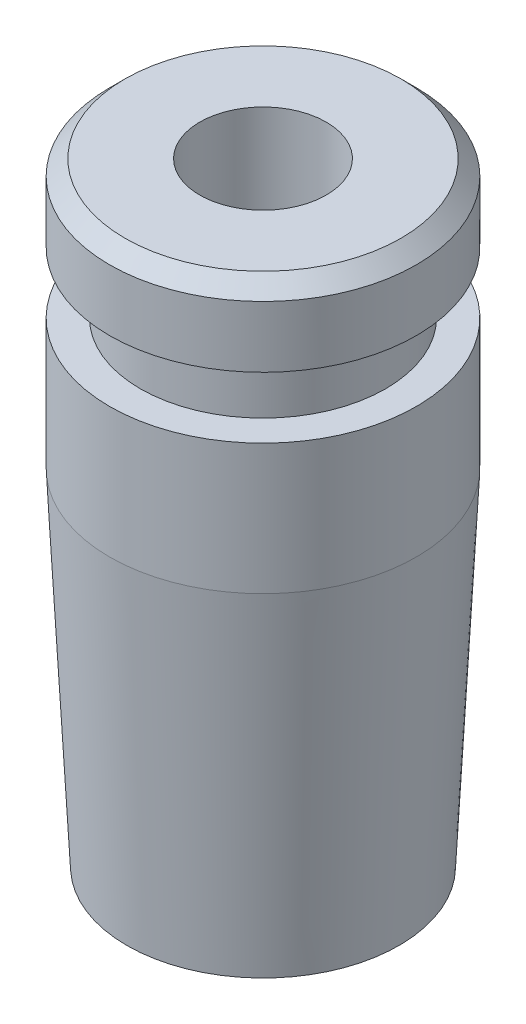
ISO-10303-21;
HEADER;
FILE_DESCRIPTION(('STEP AP214'),'2;1');
FILE_NAME('part.step','',(''),(''),'','','');
FILE_SCHEMA(('AUTOMOTIVE_DESIGN { 1 0 10303 214 1 1 1 1 }'));
ENDSEC;
DATA;
#1=APPLICATION_CONTEXT('core data for automotive mechanical design processes');
#2=APPLICATION_PROTOCOL_DEFINITION('international standard','automotive_design',2000,#1);
#3=PRODUCT_CONTEXT('',#1,'mechanical');
#4=PRODUCT('Part','Part','',(#3));
#5=PRODUCT_RELATED_PRODUCT_CATEGORY('part','',(#4));
#6=PRODUCT_DEFINITION_FORMATION('','',#4);
#7=PRODUCT_DEFINITION_CONTEXT('part definition',#1,'design');
#8=PRODUCT_DEFINITION('design','',#6,#7);
#9=PRODUCT_DEFINITION_SHAPE('','',#8);
#10=(LENGTH_UNIT() NAMED_UNIT(*) SI_UNIT(.MILLI.,.METRE.));
#11=(NAMED_UNIT(*) PLANE_ANGLE_UNIT() SI_UNIT($,.RADIAN.));
#12=(NAMED_UNIT(*) SI_UNIT($,.STERADIAN.) SOLID_ANGLE_UNIT());
#13=UNCERTAINTY_MEASURE_WITH_UNIT(LENGTH_MEASURE(1.E-05),#10,'distance_accuracy_value','');
#14=(GEOMETRIC_REPRESENTATION_CONTEXT(3) GLOBAL_UNCERTAINTY_ASSIGNED_CONTEXT((#13)) GLOBAL_UNIT_ASSIGNED_CONTEXT((#10,
#11,#12)) REPRESENTATION_CONTEXT('',''));
#15=CARTESIAN_POINT('',(0.,0.,0.));
#16=DIRECTION('',(0.,0.,1.));
#17=DIRECTION('',(1.,0.,0.));
#18=AXIS2_PLACEMENT_3D('',#15,#16,#17);
#19=CARTESIAN_POINT('',(0.,45.9930793876825,0.));
#20=DIRECTION('',(0.,1.,0.));
#21=DIRECTION('',(0.,0.,1.));
#22=AXIS2_PLACEMENT_3D('',#19,#20,#21);
#23=CYLINDRICAL_SURFACE('',#22,4.);
#24=CARTESIAN_POINT('',(0.,15.,0.));
#25=DIRECTION('',(0.,1.,0.));
#26=DIRECTION('',(0.,0.,1.));
#27=AXIS2_PLACEMENT_3D('',#24,#25,#26);
#28=CIRCLE('',#27,4.);
#29=CARTESIAN_POINT('',(0.,15.,4.));
#30=VERTEX_POINT('',#29);
#31=EDGE_CURVE('E18',#30,#30,#28,.F.);
#32=ORIENTED_EDGE('',*,*,#31,.F.);
#33=EDGE_LOOP('',(#32));
#34=FACE_BOUND('',#33,.T.);
#35=CARTESIAN_POINT('',(0.,16.5999999999826,0.));
#36=DIRECTION('',(0.,-1.,0.));
#37=DIRECTION('',(0.,0.,-1.));
#38=AXIS2_PLACEMENT_3D('',#35,#36,#37);
#39=CIRCLE('',#38,4.0000000000191);
#40=CARTESIAN_POINT('',(0.,16.5999999999826,-4.0000000000191));
#41=VERTEX_POINT('',#40);
#42=EDGE_CURVE('E30',#41,#41,#39,.F.);
#43=ORIENTED_EDGE('',*,*,#42,.F.);
#44=EDGE_LOOP('',(#43));
#45=FACE_BOUND('',#44,.T.);
#46=ADVANCED_FACE('F15',(#34,#45),#23,.T.);
#47=CARTESIAN_POINT('',(0.,16.6000000000395,0.));
#48=DIRECTION('',(0.,-1.,0.));
#49=DIRECTION('',(0.,0.,-1.));
#50=AXIS2_PLACEMENT_3D('',#47,#48,#49);
#51=CONICAL_SURFACE('',#50,3.99999999990542,0.785398163326394);
#52=ORIENTED_EDGE('',*,*,#42,.T.);
#53=EDGE_LOOP('',(#52));
#54=FACE_BOUND('',#53,.T.);
#55=CARTESIAN_POINT('',(0.,17.0000000000528,0.));
#56=DIRECTION('',(0.,-1.,0.));
#57=DIRECTION('',(0.,0.,-1.));
#58=AXIS2_PLACEMENT_3D('',#55,#56,#57);
#59=CIRCLE('',#58,3.59999999994898);
#60=CARTESIAN_POINT('',(0.,17.0000000000528,-3.59999999994898));
#61=VERTEX_POINT('',#60);
#62=EDGE_CURVE('E46',#61,#61,#59,.F.);
#63=ORIENTED_EDGE('',*,*,#62,.F.);
#64=EDGE_LOOP('',(#63));
#65=FACE_BOUND('',#64,.T.);
#66=ADVANCED_FACE('F58',(#54,#65),#51,.T.);
#67=CARTESIAN_POINT('',(-4.,15.,0.));
#68=DIRECTION('',(0.,-1.,0.));
#69=DIRECTION('',(0.,0.,-1.));
#70=AXIS2_PLACEMENT_3D('',#67,#68,#69);
#71=PLANE('',#70);
#72=ORIENTED_EDGE('',*,*,#31,.T.);
#73=EDGE_LOOP('',(#72));
#74=FACE_BOUND('',#73,.T.);
#75=CARTESIAN_POINT('',(0.,15.,0.));
#76=DIRECTION('',(0.,1.,0.));
#77=DIRECTION('',(0.,0.,1.));
#78=AXIS2_PLACEMENT_3D('',#75,#76,#77);
#79=CIRCLE('',#78,3.2);
#80=CARTESIAN_POINT('',(0.,15.,3.2));
#81=VERTEX_POINT('',#80);
#82=EDGE_CURVE('E44',#81,#81,#79,.F.);
#83=ORIENTED_EDGE('',*,*,#82,.F.);
#84=EDGE_LOOP('',(#83));
#85=FACE_BOUND('',#84,.T.);
#86=ADVANCED_FACE('F53',(#74,#85),#71,.T.);
#87=CARTESIAN_POINT('',(0.,17.,0.));
#88=DIRECTION('',(0.,1.,0.));
#89=DIRECTION('',(0.,0.,1.));
#90=AXIS2_PLACEMENT_3D('',#87,#88,#89);
#91=PLANE('',#90);
#92=CARTESIAN_POINT('',(0.,17.,0.));
#93=DIRECTION('',(0.,-1.,0.));
#94=DIRECTION('',(0.,0.,-1.));
#95=AXIS2_PLACEMENT_3D('',#92,#93,#94);
#96=CIRCLE('',#95,1.65);
#97=CARTESIAN_POINT('',(0.,17.,-1.65));
#98=VERTEX_POINT('',#97);
#99=EDGE_CURVE('E41',#98,#98,#96,.T.);
#100=ORIENTED_EDGE('',*,*,#99,.T.);
#101=EDGE_LOOP('',(#100));
#102=FACE_BOUND('',#101,.T.);
#103=ORIENTED_EDGE('',*,*,#62,.T.);
#104=EDGE_LOOP('',(#103));
#105=FACE_BOUND('',#104,.T.);
#106=ADVANCED_FACE('F68',(#102,#105),#91,.T.);
#107=CARTESIAN_POINT('',(0.,45.9930793876825,0.));
#108=DIRECTION('',(0.,1.,0.));
#109=DIRECTION('',(0.,0.,1.));
#110=AXIS2_PLACEMENT_3D('',#107,#108,#109);
#111=CYLINDRICAL_SURFACE('',#110,3.2);
#112=CARTESIAN_POINT('',(0.,13.4,0.));
#113=DIRECTION('',(0.,1.,0.));
#114=DIRECTION('',(0.,0.,1.));
#115=AXIS2_PLACEMENT_3D('',#112,#113,#114);
#116=CIRCLE('',#115,3.2);
#117=CARTESIAN_POINT('',(0.,13.4,3.2));
#118=VERTEX_POINT('',#117);
#119=EDGE_CURVE('E38',#118,#118,#116,.F.);
#120=ORIENTED_EDGE('',*,*,#119,.F.);
#121=EDGE_LOOP('',(#120));
#122=FACE_BOUND('',#121,.T.);
#123=ORIENTED_EDGE('',*,*,#82,.T.);
#124=EDGE_LOOP('',(#123));
#125=FACE_BOUND('',#124,.T.);
#126=ADVANCED_FACE('F93',(#122,#125),#111,.T.);
#127=CARTESIAN_POINT('',(0.,1.,0.));
#128=DIRECTION('',(0.,-1.,0.));
#129=DIRECTION('',(0.,0.,-1.));
#130=AXIS2_PLACEMENT_3D('',#127,#128,#129);
#131=CYLINDRICAL_SURFACE('',#130,1.65);
#132=CARTESIAN_POINT('',(0.,1.,0.));
#133=DIRECTION('',(0.,-1.,0.));
#134=DIRECTION('',(0.,0.,-1.));
#135=AXIS2_PLACEMENT_3D('',#132,#133,#134);
#136=CIRCLE('',#135,1.65);
#137=CARTESIAN_POINT('',(0.,1.,-1.65));
#138=VERTEX_POINT('',#137);
#139=EDGE_CURVE('E35',#138,#138,#136,.F.);
#140=ORIENTED_EDGE('',*,*,#139,.F.);
#141=EDGE_LOOP('',(#140));
#142=FACE_BOUND('',#141,.T.);
#143=ORIENTED_EDGE('',*,*,#99,.F.);
#144=EDGE_LOOP('',(#143));
#145=FACE_BOUND('',#144,.T.);
#146=ADVANCED_FACE('F89',(#142,#145),#131,.F.);
#147=CARTESIAN_POINT('',(-3.2,13.4,0.));
#148=DIRECTION('',(0.,1.,0.));
#149=DIRECTION('',(0.,0.,1.));
#150=AXIS2_PLACEMENT_3D('',#147,#148,#149);
#151=PLANE('',#150);
#152=ORIENTED_EDGE('',*,*,#119,.T.);
#153=EDGE_LOOP('',(#152));
#154=FACE_BOUND('',#153,.T.);
#155=CARTESIAN_POINT('',(0.,13.4,0.));
#156=DIRECTION('',(0.,1.,0.));
#157=DIRECTION('',(0.,0.,1.));
#158=AXIS2_PLACEMENT_3D('',#155,#156,#157);
#159=CIRCLE('',#158,4.);
#160=CARTESIAN_POINT('',(0.,13.4,4.));
#161=VERTEX_POINT('',#160);
#162=EDGE_CURVE('E27',#161,#161,#159,.F.);
#163=ORIENTED_EDGE('',*,*,#162,.F.);
#164=EDGE_LOOP('',(#163));
#165=FACE_BOUND('',#164,.T.);
#166=ADVANCED_FACE('F85',(#154,#165),#151,.T.);
#167=CARTESIAN_POINT('',(-3.55000003560641,1.,0.));
#168=DIRECTION('',(0.,-1.,0.));
#169=DIRECTION('',(0.,0.,-1.));
#170=AXIS2_PLACEMENT_3D('',#167,#168,#169);
#171=PLANE('',#170);
#172=CARTESIAN_POINT('',(0.,0.999999999976353,0.));
#173=DIRECTION('',(0.,1.,0.));
#174=DIRECTION('',(0.,0.,1.));
#175=AXIS2_PLACEMENT_3D('',#172,#173,#174);
#176=CIRCLE('',#175,3.55000003560591);
#177=CARTESIAN_POINT('',(0.,0.999999999976353,3.55000003560591));
#178=VERTEX_POINT('',#177);
#179=EDGE_CURVE('E22',#178,#178,#176,.T.);
#180=ORIENTED_EDGE('',*,*,#179,.F.);
#181=EDGE_LOOP('',(#180));
#182=FACE_BOUND('',#181,.T.);
#183=ORIENTED_EDGE('',*,*,#139,.T.);
#184=EDGE_LOOP('',(#183));
#185=FACE_BOUND('',#184,.T.);
#186=ADVANCED_FACE('F78',(#182,#185),#171,.T.);
#187=CARTESIAN_POINT('',(0.,45.9930793876825,0.));
#188=DIRECTION('',(0.,1.,0.));
#189=DIRECTION('',(0.,0.,1.));
#190=AXIS2_PLACEMENT_3D('',#187,#188,#189);
#191=CYLINDRICAL_SURFACE('',#190,4.);
#192=ORIENTED_EDGE('',*,*,#162,.T.);
#193=EDGE_LOOP('',(#192));
#194=FACE_BOUND('',#193,.T.);
#195=CARTESIAN_POINT('',(0.,9.99999999999091,0.));
#196=DIRECTION('',(0.,1.,0.));
#197=DIRECTION('',(0.,0.,1.));
#198=AXIS2_PLACEMENT_3D('',#195,#196,#197);
#199=CIRCLE('',#198,4.00000000000133);
#200=CARTESIAN_POINT('',(0.,9.99999999999091,4.00000000000133));
#201=VERTEX_POINT('',#200);
#202=EDGE_CURVE('E10',#201,#201,#199,.F.);
#203=ORIENTED_EDGE('',*,*,#202,.F.);
#204=EDGE_LOOP('',(#203));
#205=FACE_BOUND('',#204,.T.);
#206=ADVANCED_FACE('F72',(#194,#205),#191,.T.);
#207=CARTESIAN_POINT('',(0.,9.99999999999091,0.));
#208=DIRECTION('',(0.,1.,0.));
#209=DIRECTION('',(0.,0.,1.));
#210=AXIS2_PLACEMENT_3D('',#207,#208,#209);
#211=CONICAL_SURFACE('',#210,4.00000000000133,0.0499583917756644);
#212=ORIENTED_EDGE('',*,*,#202,.T.);
#213=EDGE_LOOP('',(#212));
#214=FACE_BOUND('',#213,.T.);
#215=ORIENTED_EDGE('',*,*,#179,.T.);
#216=EDGE_LOOP('',(#215));
#217=FACE_BOUND('',#216,.T.);
#218=ADVANCED_FACE('F70',(#214,#217),#211,.T.);
#219=CLOSED_SHELL('',(#46,#66,#86,#106,#126,#146,#166,#186,#206,#218));
#220=MANIFOLD_SOLID_BREP('B1',#219);
#221=ADVANCED_BREP_SHAPE_REPRESENTATION('',(#18,#220),#14);
#222=SHAPE_DEFINITION_REPRESENTATION(#9,#221);
ENDSEC;
END-ISO-10303-21;
